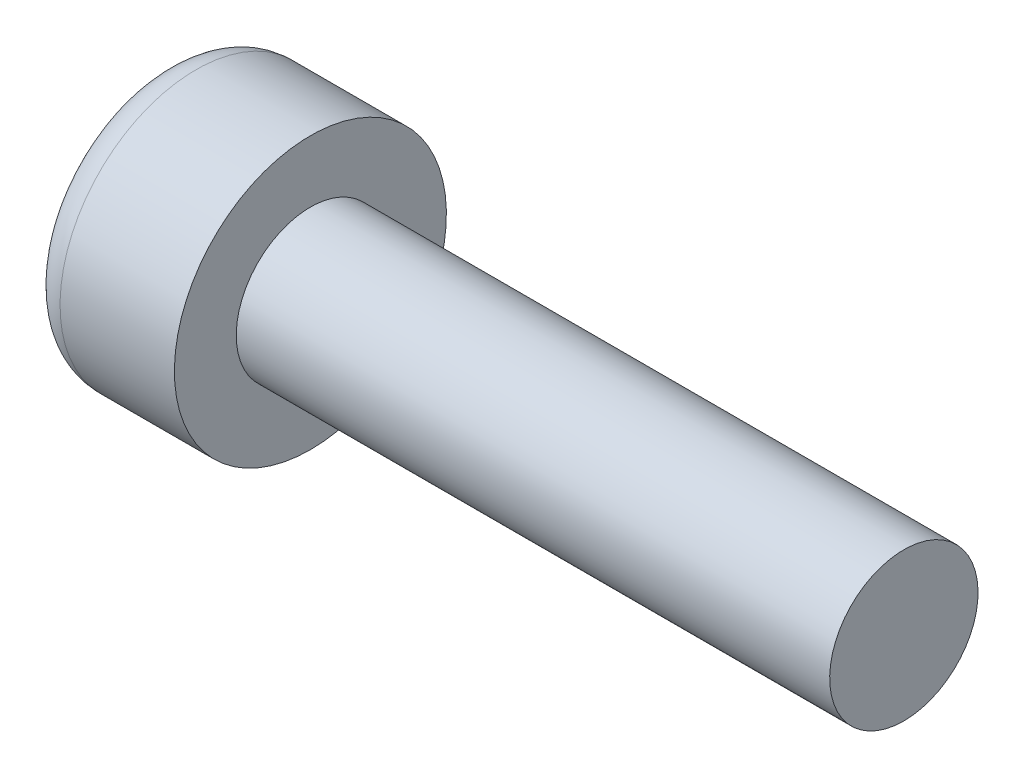
ISO-10303-21;
HEADER;
FILE_DESCRIPTION(('STEP AP214'),'2;1');
FILE_NAME('part.step','',(''),(''),'','','');
FILE_SCHEMA(('AUTOMOTIVE_DESIGN { 1 0 10303 214 1 1 1 1 }'));
ENDSEC;
DATA;
#1=APPLICATION_CONTEXT('core data for automotive mechanical design processes');
#2=APPLICATION_PROTOCOL_DEFINITION('international standard','automotive_design',2000,#1);
#3=PRODUCT_CONTEXT('',#1,'mechanical');
#4=PRODUCT('Part','Part','',(#3));
#5=PRODUCT_RELATED_PRODUCT_CATEGORY('part','',(#4));
#6=PRODUCT_DEFINITION_FORMATION('','',#4);
#7=PRODUCT_DEFINITION_CONTEXT('part definition',#1,'design');
#8=PRODUCT_DEFINITION('design','',#6,#7);
#9=PRODUCT_DEFINITION_SHAPE('','',#8);
#10=(LENGTH_UNIT() NAMED_UNIT(*) SI_UNIT(.MILLI.,.METRE.));
#11=(NAMED_UNIT(*) PLANE_ANGLE_UNIT() SI_UNIT($,.RADIAN.));
#12=(NAMED_UNIT(*) SI_UNIT($,.STERADIAN.) SOLID_ANGLE_UNIT());
#13=UNCERTAINTY_MEASURE_WITH_UNIT(LENGTH_MEASURE(1.E-05),#10,'distance_accuracy_value','');
#14=(GEOMETRIC_REPRESENTATION_CONTEXT(3) GLOBAL_UNCERTAINTY_ASSIGNED_CONTEXT((#13)) GLOBAL_UNIT_ASSIGNED_CONTEXT((#10,
#11,#12)) REPRESENTATION_CONTEXT('',''));
#15=CARTESIAN_POINT('',(0.,0.,0.));
#16=DIRECTION('',(0.,0.,1.));
#17=DIRECTION('',(1.,0.,0.));
#18=AXIS2_PLACEMENT_3D('',#15,#16,#17);
#19=CARTESIAN_POINT('',(0.,0.,0.));
#20=DIRECTION('',(1.,0.,0.));
#21=DIRECTION('',(0.,1.,0.));
#22=AXIS2_PLACEMENT_3D('',#19,#20,#21);
#23=PLANE('',#22);
#24=DIRECTION('',(0.,-0.5,-0.866025403784438));
#25=VECTOR('',#24,1.);
#26=CARTESIAN_POINT('',(0.,1.44337567297406,0.));
#27=LINE('',#26,#25);
#28=CARTESIAN_POINT('',(0.,1.44337567297406,0.));
#29=VERTEX_POINT('',#28);
#30=CARTESIAN_POINT('',(0.,0.721687836487031,-1.25));
#31=VERTEX_POINT('',#30);
#32=EDGE_CURVE('E121',#29,#31,#27,.T.);
#33=ORIENTED_EDGE('',*,*,#32,.F.);
#34=DIRECTION('',(0.,0.5,-0.866025403784439));
#35=VECTOR('',#34,1.);
#36=CARTESIAN_POINT('',(0.,0.721687836487032,1.25));
#37=LINE('',#36,#35);
#38=CARTESIAN_POINT('',(0.,0.721687836487032,1.25));
#39=VERTEX_POINT('',#38);
#40=EDGE_CURVE('E47',#39,#29,#37,.T.);
#41=ORIENTED_EDGE('',*,*,#40,.F.);
#42=DIRECTION('',(0.,1.,0.));
#43=VECTOR('',#42,1.);
#44=CARTESIAN_POINT('',(0.,-0.721687836487031,1.25));
#45=LINE('',#44,#43);
#46=CARTESIAN_POINT('',(0.,-0.721687836487031,1.25));
#47=VERTEX_POINT('',#46);
#48=EDGE_CURVE('E130',#47,#39,#45,.T.);
#49=ORIENTED_EDGE('',*,*,#48,.F.);
#50=DIRECTION('',(0.,0.5,0.866025403784439));
#51=VECTOR('',#50,1.);
#52=CARTESIAN_POINT('',(0.,-1.44337567297406,0.));
#53=LINE('',#52,#51);
#54=CARTESIAN_POINT('',(0.,-1.44337567297406,0.));
#55=VERTEX_POINT('',#54);
#56=EDGE_CURVE('E128',#55,#47,#53,.T.);
#57=ORIENTED_EDGE('',*,*,#56,.F.);
#58=DIRECTION('',(0.,-0.5,0.866025403784438));
#59=VECTOR('',#58,1.);
#60=CARTESIAN_POINT('',(0.,-0.721687836487032,-1.25));
#61=LINE('',#60,#59);
#62=CARTESIAN_POINT('',(0.,-0.721687836487032,-1.25));
#63=VERTEX_POINT('',#62);
#64=EDGE_CURVE('E95',#63,#55,#61,.T.);
#65=ORIENTED_EDGE('',*,*,#64,.F.);
#66=DIRECTION('',(0.,-1.,0.));
#67=VECTOR('',#66,1.);
#68=CARTESIAN_POINT('',(0.,0.721687836487031,-1.25));
#69=LINE('',#68,#67);
#70=EDGE_CURVE('E124',#31,#63,#69,.T.);
#71=ORIENTED_EDGE('',*,*,#70,.F.);
#72=EDGE_LOOP('',(#33,#41,#49,#57,#65,#71));
#73=FACE_BOUND('',#72,.T.);
#74=CARTESIAN_POINT('',(0.,0.,0.));
#75=DIRECTION('',(-1.,0.,0.));
#76=DIRECTION('',(0.,-1.,0.));
#77=AXIS2_PLACEMENT_3D('',#74,#75,#76);
#78=CIRCLE('',#77,2.0625);
#79=CARTESIAN_POINT('',(0.,-2.0625,0.));
#80=VERTEX_POINT('',#79);
#81=EDGE_CURVE('E11',#80,#80,#78,.T.);
#82=ORIENTED_EDGE('',*,*,#81,.T.);
#83=EDGE_LOOP('',(#82));
#84=FACE_BOUND('',#83,.T.);
#85=ADVANCED_FACE('F33',(#73,#84),#23,.F.);
#86=CARTESIAN_POINT('',(0.6875,0.,0.));
#87=DIRECTION('',(-1.,0.,0.));
#88=DIRECTION('',(0.,-1.,0.));
#89=AXIS2_PLACEMENT_3D('',#86,#87,#88);
#90=TOROIDAL_SURFACE('',#89,2.0625,0.6875);
#91=ORIENTED_EDGE('',*,*,#81,.F.);
#92=EDGE_LOOP('',(#91));
#93=FACE_BOUND('',#92,.T.);
#94=CARTESIAN_POINT('',(0.6875,0.,0.));
#95=DIRECTION('',(-1.,0.,0.));
#96=DIRECTION('',(0.,-1.,0.));
#97=AXIS2_PLACEMENT_3D('',#94,#95,#96);
#98=CIRCLE('',#97,2.75);
#99=CARTESIAN_POINT('',(0.687500000000001,-2.75,0.));
#100=VERTEX_POINT('',#99);
#101=EDGE_CURVE('E40',#100,#100,#98,.T.);
#102=ORIENTED_EDGE('',*,*,#101,.T.);
#103=EDGE_LOOP('',(#102));
#104=FACE_BOUND('',#103,.T.);
#105=ADVANCED_FACE('F150',(#93,#104),#90,.T.);
#106=CARTESIAN_POINT('',(0.,0.,0.));
#107=DIRECTION('',(-1.,0.,0.));
#108=DIRECTION('',(0.,-1.,0.));
#109=AXIS2_PLACEMENT_3D('',#106,#107,#108);
#110=CYLINDRICAL_SURFACE('',#109,2.75);
#111=ORIENTED_EDGE('',*,*,#101,.F.);
#112=EDGE_LOOP('',(#111));
#113=FACE_BOUND('',#112,.T.);
#114=CARTESIAN_POINT('',(3.,0.,0.));
#115=DIRECTION('',(-1.,0.,0.));
#116=DIRECTION('',(0.,-1.,0.));
#117=AXIS2_PLACEMENT_3D('',#114,#115,#116);
#118=CIRCLE('',#117,2.75);
#119=CARTESIAN_POINT('',(3.,-2.75,0.));
#120=VERTEX_POINT('',#119);
#121=EDGE_CURVE('E145',#120,#120,#118,.T.);
#122=ORIENTED_EDGE('',*,*,#121,.T.);
#123=EDGE_LOOP('',(#122));
#124=FACE_BOUND('',#123,.T.);
#125=ADVANCED_FACE('F152',(#113,#124),#110,.T.);
#126=CARTESIAN_POINT('',(3.,2.75,0.));
#127=DIRECTION('',(-1.,0.,0.));
#128=DIRECTION('',(0.,-1.,0.));
#129=AXIS2_PLACEMENT_3D('',#126,#127,#128);
#130=PLANE('',#129);
#131=ORIENTED_EDGE('',*,*,#121,.F.);
#132=EDGE_LOOP('',(#131));
#133=FACE_BOUND('',#132,.T.);
#134=CARTESIAN_POINT('',(3.,0.,0.));
#135=DIRECTION('',(-1.,0.,0.));
#136=DIRECTION('',(0.,-1.,0.));
#137=AXIS2_PLACEMENT_3D('',#134,#135,#136);
#138=CIRCLE('',#137,1.5);
#139=CARTESIAN_POINT('',(3.,-1.5,0.));
#140=VERTEX_POINT('',#139);
#141=EDGE_CURVE('E142',#140,#140,#138,.T.);
#142=ORIENTED_EDGE('',*,*,#141,.T.);
#143=EDGE_LOOP('',(#142));
#144=FACE_BOUND('',#143,.T.);
#145=ADVANCED_FACE('F155',(#133,#144),#130,.F.);
#146=CARTESIAN_POINT('',(0.,0.,0.));
#147=DIRECTION('',(-1.,0.,0.));
#148=DIRECTION('',(0.,-1.,0.));
#149=AXIS2_PLACEMENT_3D('',#146,#147,#148);
#150=CYLINDRICAL_SURFACE('',#149,1.5);
#151=ORIENTED_EDGE('',*,*,#141,.F.);
#152=EDGE_LOOP('',(#151));
#153=FACE_BOUND('',#152,.T.);
#154=CARTESIAN_POINT('',(15.,0.,0.));
#155=DIRECTION('',(-1.,0.,0.));
#156=DIRECTION('',(0.,-1.,0.));
#157=AXIS2_PLACEMENT_3D('',#154,#155,#156);
#158=CIRCLE('',#157,1.5);
#159=CARTESIAN_POINT('',(15.,-1.49999999999999,0.));
#160=VERTEX_POINT('',#159);
#161=EDGE_CURVE('E134',#160,#160,#158,.T.);
#162=ORIENTED_EDGE('',*,*,#161,.T.);
#163=EDGE_LOOP('',(#162));
#164=FACE_BOUND('',#163,.T.);
#165=ADVANCED_FACE('F161',(#153,#164),#150,.T.);
#166=CARTESIAN_POINT('',(15.,1.5,0.));
#167=DIRECTION('',(-1.,0.,0.));
#168=DIRECTION('',(0.,-1.,0.));
#169=AXIS2_PLACEMENT_3D('',#166,#167,#168);
#170=PLANE('',#169);
#171=ORIENTED_EDGE('',*,*,#161,.F.);
#172=EDGE_LOOP('',(#171));
#173=FACE_BOUND('',#172,.T.);
#174=ADVANCED_FACE('F167',(#173),#170,.F.);
#175=CARTESIAN_POINT('',(1.5,0.721687836487032,1.25));
#176=DIRECTION('',(0.,0.866025403784438,0.5));
#177=DIRECTION('',(0.,-0.5,0.866025403784439));
#178=AXIS2_PLACEMENT_3D('',#175,#176,#177);
#179=PLANE('',#178);
#180=ORIENTED_EDGE('',*,*,#40,.T.);
#181=DIRECTION('',(-1.,0.,0.));
#182=VECTOR('',#181,1.);
#183=CARTESIAN_POINT('',(1.5,1.44337567297406,0.));
#184=LINE('',#183,#182);
#185=CARTESIAN_POINT('',(1.5,1.44337567297406,0.));
#186=VERTEX_POINT('',#185);
#187=EDGE_CURVE('E77',#186,#29,#184,.T.);
#188=ORIENTED_EDGE('',*,*,#187,.F.);
#189=DIRECTION('',(0.,0.5,-0.866025403784439));
#190=VECTOR('',#189,1.);
#191=CARTESIAN_POINT('',(1.5,0.721687836487032,1.25));
#192=LINE('',#191,#190);
#193=CARTESIAN_POINT('',(1.5,0.721687836487032,1.25));
#194=VERTEX_POINT('',#193);
#195=EDGE_CURVE('E132',#194,#186,#192,.T.);
#196=ORIENTED_EDGE('',*,*,#195,.F.);
#197=DIRECTION('',(-1.,0.,0.));
#198=VECTOR('',#197,1.);
#199=CARTESIAN_POINT('',(1.5,0.721687836487032,1.25));
#200=LINE('',#199,#198);
#201=EDGE_CURVE('E55',#194,#39,#200,.T.);
#202=ORIENTED_EDGE('',*,*,#201,.T.);
#203=EDGE_LOOP('',(#180,#188,#196,#202));
#204=FACE_BOUND('',#203,.T.);
#205=ADVANCED_FACE('F172',(#204),#179,.F.);
#206=CARTESIAN_POINT('',(1.5,-0.721687836487031,1.25));
#207=DIRECTION('',(0.,0.,1.));
#208=DIRECTION('',(1.,0.,0.));
#209=AXIS2_PLACEMENT_3D('',#206,#207,#208);
#210=PLANE('',#209);
#211=ORIENTED_EDGE('',*,*,#48,.T.);
#212=ORIENTED_EDGE('',*,*,#201,.F.);
#213=DIRECTION('',(0.,1.,0.));
#214=VECTOR('',#213,1.);
#215=CARTESIAN_POINT('',(1.5,-0.721687836487031,1.25));
#216=LINE('',#215,#214);
#217=CARTESIAN_POINT('',(1.5,-0.721687836487031,1.25));
#218=VERTEX_POINT('',#217);
#219=EDGE_CURVE('E107',#218,#194,#216,.T.);
#220=ORIENTED_EDGE('',*,*,#219,.F.);
#221=DIRECTION('',(-1.,0.,0.));
#222=VECTOR('',#221,1.);
#223=CARTESIAN_POINT('',(1.5,-0.721687836487031,1.25));
#224=LINE('',#223,#222);
#225=EDGE_CURVE('E99',#218,#47,#224,.T.);
#226=ORIENTED_EDGE('',*,*,#225,.T.);
#227=EDGE_LOOP('',(#211,#212,#220,#226));
#228=FACE_BOUND('',#227,.T.);
#229=ADVANCED_FACE('F177',(#228),#210,.F.);
#230=CARTESIAN_POINT('',(1.5,-1.44337567297406,0.));
#231=DIRECTION('',(0.,-0.866025403784439,0.5));
#232=DIRECTION('',(0.,-0.5,-0.866025403784439));
#233=AXIS2_PLACEMENT_3D('',#230,#231,#232);
#234=PLANE('',#233);
#235=ORIENTED_EDGE('',*,*,#56,.T.);
#236=ORIENTED_EDGE('',*,*,#225,.F.);
#237=DIRECTION('',(0.,0.5,0.866025403784439));
#238=VECTOR('',#237,1.);
#239=CARTESIAN_POINT('',(1.5,-1.44337567297406,0.));
#240=LINE('',#239,#238);
#241=CARTESIAN_POINT('',(1.5,-1.44337567297406,0.));
#242=VERTEX_POINT('',#241);
#243=EDGE_CURVE('E103',#242,#218,#240,.T.);
#244=ORIENTED_EDGE('',*,*,#243,.F.);
#245=DIRECTION('',(-1.,0.,0.));
#246=VECTOR('',#245,1.);
#247=CARTESIAN_POINT('',(1.5,-1.44337567297406,0.));
#248=LINE('',#247,#246);
#249=EDGE_CURVE('E88',#242,#55,#248,.T.);
#250=ORIENTED_EDGE('',*,*,#249,.T.);
#251=EDGE_LOOP('',(#235,#236,#244,#250));
#252=FACE_BOUND('',#251,.T.);
#253=ADVANCED_FACE('F104',(#252),#234,.F.);
#254=CARTESIAN_POINT('',(1.5,-0.721687836487032,-1.25));
#255=DIRECTION('',(0.,-0.866025403784438,-0.5));
#256=DIRECTION('',(0.,0.5,-0.866025403784438));
#257=AXIS2_PLACEMENT_3D('',#254,#255,#256);
#258=PLANE('',#257);
#259=ORIENTED_EDGE('',*,*,#64,.T.);
#260=ORIENTED_EDGE('',*,*,#249,.F.);
#261=DIRECTION('',(0.,-0.5,0.866025403784438));
#262=VECTOR('',#261,1.);
#263=CARTESIAN_POINT('',(1.5,-0.721687836487032,-1.25));
#264=LINE('',#263,#262);
#265=CARTESIAN_POINT('',(1.5,-0.721687836487032,-1.25));
#266=VERTEX_POINT('',#265);
#267=EDGE_CURVE('E92',#266,#242,#264,.T.);
#268=ORIENTED_EDGE('',*,*,#267,.F.);
#269=DIRECTION('',(-1.,0.,0.));
#270=VECTOR('',#269,1.);
#271=CARTESIAN_POINT('',(1.5,-0.721687836487032,-1.25));
#272=LINE('',#271,#270);
#273=EDGE_CURVE('E100',#266,#63,#272,.T.);
#274=ORIENTED_EDGE('',*,*,#273,.T.);
#275=EDGE_LOOP('',(#259,#260,#268,#274));
#276=FACE_BOUND('',#275,.T.);
#277=ADVANCED_FACE('F90',(#276),#258,.F.);
#278=CARTESIAN_POINT('',(1.5,0.721687836487031,-1.25));
#279=DIRECTION('',(0.,0.,-1.));
#280=DIRECTION('',(-1.,0.,0.));
#281=AXIS2_PLACEMENT_3D('',#278,#279,#280);
#282=PLANE('',#281);
#283=ORIENTED_EDGE('',*,*,#70,.T.);
#284=ORIENTED_EDGE('',*,*,#273,.F.);
#285=DIRECTION('',(0.,-1.,0.));
#286=VECTOR('',#285,1.);
#287=CARTESIAN_POINT('',(1.5,0.721687836487031,-1.25));
#288=LINE('',#287,#286);
#289=CARTESIAN_POINT('',(1.5,0.721687836487031,-1.25));
#290=VERTEX_POINT('',#289);
#291=EDGE_CURVE('E113',#290,#266,#288,.T.);
#292=ORIENTED_EDGE('',*,*,#291,.F.);
#293=DIRECTION('',(-1.,0.,0.));
#294=VECTOR('',#293,1.);
#295=CARTESIAN_POINT('',(1.5,0.721687836487031,-1.25));
#296=LINE('',#295,#294);
#297=EDGE_CURVE('E137',#290,#31,#296,.T.);
#298=ORIENTED_EDGE('',*,*,#297,.T.);
#299=EDGE_LOOP('',(#283,#284,#292,#298));
#300=FACE_BOUND('',#299,.T.);
#301=ADVANCED_FACE('F203',(#300),#282,.F.);
#302=CARTESIAN_POINT('',(1.5,1.44337567297406,0.));
#303=DIRECTION('',(0.,0.866025403784438,-0.5));
#304=DIRECTION('',(0.,0.5,0.866025403784439));
#305=AXIS2_PLACEMENT_3D('',#302,#303,#304);
#306=PLANE('',#305);
#307=ORIENTED_EDGE('',*,*,#32,.T.);
#308=ORIENTED_EDGE('',*,*,#297,.F.);
#309=DIRECTION('',(0.,-0.5,-0.866025403784438));
#310=VECTOR('',#309,1.);
#311=CARTESIAN_POINT('',(1.5,1.44337567297406,0.));
#312=LINE('',#311,#310);
#313=EDGE_CURVE('E115',#186,#290,#312,.T.);
#314=ORIENTED_EDGE('',*,*,#313,.F.);
#315=ORIENTED_EDGE('',*,*,#187,.T.);
#316=EDGE_LOOP('',(#307,#308,#314,#315));
#317=FACE_BOUND('',#316,.T.);
#318=ADVANCED_FACE('F191',(#317),#306,.F.);
#319=CARTESIAN_POINT('',(1.5,0.,0.));
#320=DIRECTION('',(-1.,0.,0.));
#321=DIRECTION('',(0.,-1.,0.));
#322=AXIS2_PLACEMENT_3D('',#319,#320,#321);
#323=PLANE('',#322);
#324=ORIENTED_EDGE('',*,*,#195,.T.);
#325=ORIENTED_EDGE('',*,*,#313,.T.);
#326=ORIENTED_EDGE('',*,*,#291,.T.);
#327=ORIENTED_EDGE('',*,*,#267,.T.);
#328=ORIENTED_EDGE('',*,*,#243,.T.);
#329=ORIENTED_EDGE('',*,*,#219,.T.);
#330=EDGE_LOOP('',(#324,#325,#326,#327,#328,#329));
#331=FACE_BOUND('',#330,.T.);
#332=ADVANCED_FACE('F110',(#331),#323,.T.);
#333=CLOSED_SHELL('',(#85,#105,#125,#145,#165,#174,#205,#229,#253,#277,#301,#318,#332));
#334=MANIFOLD_SOLID_BREP('B2',#333);
#335=ADVANCED_BREP_SHAPE_REPRESENTATION('',(#18,#334),#14);
#336=SHAPE_DEFINITION_REPRESENTATION(#9,#335);
ENDSEC;
END-ISO-10303-21;
